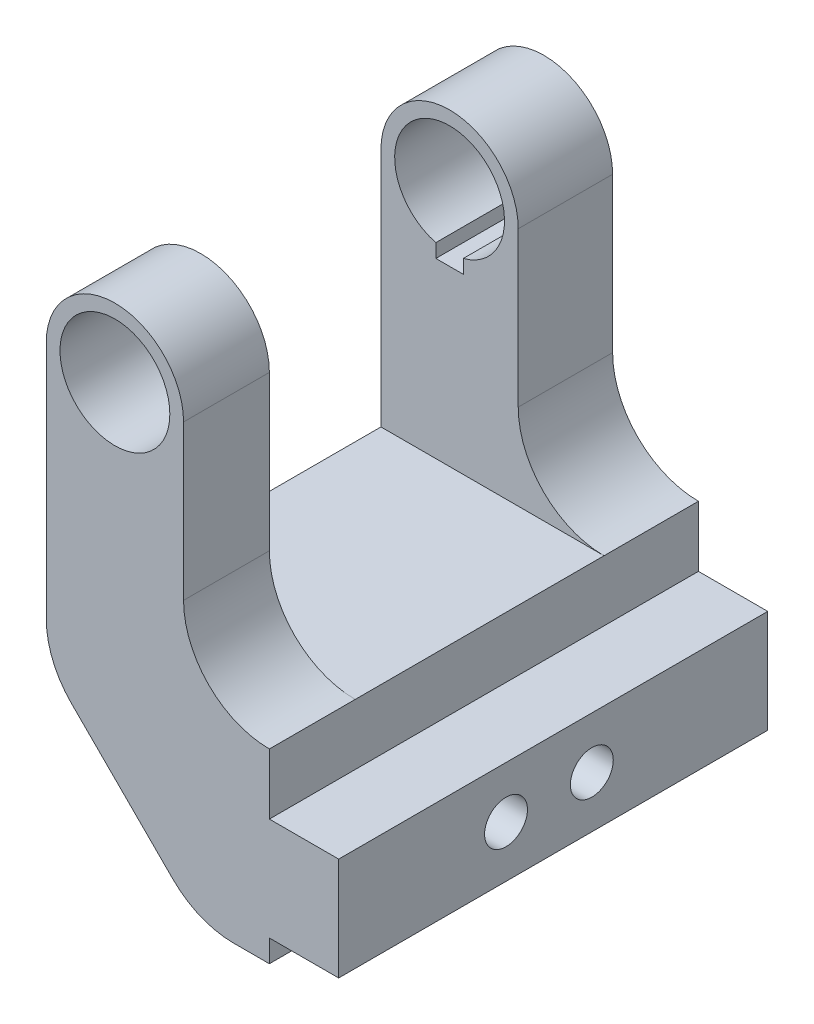
ISO-10303-21;
HEADER;
FILE_DESCRIPTION(('STEP AP214'),'2;1');
FILE_NAME('part.step','',(''),(''),'','','');
FILE_SCHEMA(('AUTOMOTIVE_DESIGN { 1 0 10303 214 1 1 1 1 }'));
ENDSEC;
DATA;
#1=APPLICATION_CONTEXT('core data for automotive mechanical design processes');
#2=APPLICATION_PROTOCOL_DEFINITION('international standard','automotive_design',2000,#1);
#3=PRODUCT_CONTEXT('',#1,'mechanical');
#4=PRODUCT('Part','Part','',(#3));
#5=PRODUCT_RELATED_PRODUCT_CATEGORY('part','',(#4));
#6=PRODUCT_DEFINITION_FORMATION('','',#4);
#7=PRODUCT_DEFINITION_CONTEXT('part definition',#1,'design');
#8=PRODUCT_DEFINITION('design','',#6,#7);
#9=PRODUCT_DEFINITION_SHAPE('','',#8);
#10=(LENGTH_UNIT() NAMED_UNIT(*) SI_UNIT(.MILLI.,.METRE.));
#11=(NAMED_UNIT(*) PLANE_ANGLE_UNIT() SI_UNIT($,.RADIAN.));
#12=(NAMED_UNIT(*) SI_UNIT($,.STERADIAN.) SOLID_ANGLE_UNIT());
#13=UNCERTAINTY_MEASURE_WITH_UNIT(LENGTH_MEASURE(1.E-05),#10,'distance_accuracy_value','');
#14=(GEOMETRIC_REPRESENTATION_CONTEXT(3) GLOBAL_UNCERTAINTY_ASSIGNED_CONTEXT((#13)) GLOBAL_UNIT_ASSIGNED_CONTEXT((#10,
#11,#12)) REPRESENTATION_CONTEXT('',''));
#15=CARTESIAN_POINT('',(0.,0.,0.));
#16=DIRECTION('',(0.,0.,1.));
#17=DIRECTION('',(1.,0.,0.));
#18=AXIS2_PLACEMENT_3D('',#15,#16,#17);
#19=CARTESIAN_POINT('',(-8.,0.,0.));
#20=DIRECTION('',(-1.,0.,0.));
#21=DIRECTION('',(0.,-1.,0.));
#22=AXIS2_PLACEMENT_3D('',#19,#20,#21);
#23=PLANE('',#22);
#24=DIRECTION('',(0.,-1.,0.));
#25=VECTOR('',#24,1.);
#26=CARTESIAN_POINT('',(-8.,0.,0.));
#27=LINE('',#26,#25);
#28=CARTESIAN_POINT('',(-8.,0.,0.));
#29=VERTEX_POINT('',#28);
#30=CARTESIAN_POINT('',(-8.,-27.857864376269,0.));
#31=VERTEX_POINT('',#30);
#32=EDGE_CURVE('E303',#29,#31,#27,.T.);
#33=ORIENTED_EDGE('',*,*,#32,.T.);
#34=DIRECTION('',(0.,0.,1.));
#35=VECTOR('',#34,1.);
#36=CARTESIAN_POINT('',(-8.,-27.857864376269,0.));
#37=LINE('',#36,#35);
#38=CARTESIAN_POINT('',(-8.00000000000066,-27.857864376269,11.));
#39=VERTEX_POINT('',#38);
#40=EDGE_CURVE('E420',#31,#39,#37,.T.);
#41=ORIENTED_EDGE('',*,*,#40,.T.);
#42=DIRECTION('',(0.,1.,0.));
#43=VECTOR('',#42,1.);
#44=CARTESIAN_POINT('',(-8.00000000000194,14.034109989606,11.));
#45=LINE('',#44,#43);
#46=CARTESIAN_POINT('',(-8.,0.,11.));
#47=VERTEX_POINT('',#46);
#48=EDGE_CURVE('E282',#39,#47,#45,.T.);
#49=ORIENTED_EDGE('',*,*,#48,.T.);
#50=DIRECTION('',(0.,0.,1.));
#51=VECTOR('',#50,1.);
#52=CARTESIAN_POINT('',(-8.,0.,0.));
#53=LINE('',#52,#51);
#54=EDGE_CURVE('E374',#29,#47,#53,.T.);
#55=ORIENTED_EDGE('',*,*,#54,.F.);
#56=EDGE_LOOP('',(#33,#41,#49,#55));
#57=FACE_BOUND('',#56,.T.);
#58=ADVANCED_FACE('F35',(#57),#23,.T.);
#59=CARTESIAN_POINT('',(0.,0.,0.));
#60=DIRECTION('',(0.,0.,1.));
#61=DIRECTION('',(1.,0.,0.));
#62=AXIS2_PLACEMENT_3D('',#59,#60,#61);
#63=CYLINDRICAL_SURFACE('',#62,8.);
#64=CARTESIAN_POINT('',(0.,0.,40.));
#65=DIRECTION('',(0.,0.,1.));
#66=DIRECTION('',(1.,0.,0.));
#67=AXIS2_PLACEMENT_3D('',#64,#65,#66);
#68=CIRCLE('',#67,8.);
#69=CARTESIAN_POINT('',(-8.00000000000151,0.,40.));
#70=VERTEX_POINT('',#69);
#71=CARTESIAN_POINT('',(8.,0.,40.));
#72=VERTEX_POINT('',#71);
#73=EDGE_CURVE('E297',#70,#72,#68,.F.);
#74=ORIENTED_EDGE('',*,*,#73,.F.);
#75=CARTESIAN_POINT('',(-8.,0.,50.));
#76=VERTEX_POINT('',#75);
#77=EDGE_CURVE('E329',#70,#76,#53,.T.);
#78=ORIENTED_EDGE('',*,*,#77,.T.);
#79=CARTESIAN_POINT('',(0.,0.,50.));
#80=DIRECTION('',(0.,0.,1.));
#81=DIRECTION('',(1.,0.,0.));
#82=AXIS2_PLACEMENT_3D('',#79,#80,#81);
#83=CIRCLE('',#82,8.);
#84=CARTESIAN_POINT('',(8.,0.,50.));
#85=VERTEX_POINT('',#84);
#86=EDGE_CURVE('E379',#85,#76,#83,.T.);
#87=ORIENTED_EDGE('',*,*,#86,.F.);
#88=DIRECTION('',(0.,0.,1.));
#89=VECTOR('',#88,1.);
#90=CARTESIAN_POINT('',(8.,0.,0.));
#91=LINE('',#90,#89);
#92=EDGE_CURVE('E357',#72,#85,#91,.T.);
#93=ORIENTED_EDGE('',*,*,#92,.F.);
#94=EDGE_LOOP('',(#74,#78,#87,#93));
#95=FACE_BOUND('',#94,.T.);
#96=ADVANCED_FACE('F471',(#95),#63,.T.);
#97=CARTESIAN_POINT('',(0.,0.,50.));
#98=DIRECTION('',(0.,0.,-1.));
#99=DIRECTION('',(-1.,0.,0.));
#100=AXIS2_PLACEMENT_3D('',#97,#98,#99);
#101=CYLINDRICAL_SURFACE('',#100,6.4);
#102=CARTESIAN_POINT('',(0.,0.,40.));
#103=DIRECTION('',(0.,0.,1.));
#104=DIRECTION('',(1.,0.,0.));
#105=AXIS2_PLACEMENT_3D('',#102,#103,#104);
#106=CIRCLE('',#105,6.4);
#107=CARTESIAN_POINT('',(6.4,0.,40.));
#108=VERTEX_POINT('',#107);
#109=EDGE_CURVE('E299',#108,#108,#106,.T.);
#110=ORIENTED_EDGE('',*,*,#109,.F.);
#111=EDGE_LOOP('',(#110));
#112=FACE_BOUND('',#111,.T.);
#113=CARTESIAN_POINT('',(0.,0.,50.));
#114=DIRECTION('',(0.,0.,1.));
#115=DIRECTION('',(1.,0.,0.));
#116=AXIS2_PLACEMENT_3D('',#113,#114,#115);
#117=CIRCLE('',#116,6.4);
#118=CARTESIAN_POINT('',(6.4,0.,50.));
#119=VERTEX_POINT('',#118);
#120=EDGE_CURVE('E382',#119,#119,#117,.T.);
#121=ORIENTED_EDGE('',*,*,#120,.T.);
#122=EDGE_LOOP('',(#121));
#123=FACE_BOUND('',#122,.T.);
#124=ADVANCED_FACE('F526',(#112,#123),#101,.F.);
#125=CARTESIAN_POINT('',(8.,0.,0.));
#126=DIRECTION('',(1.,0.,0.));
#127=DIRECTION('',(0.,1.,0.));
#128=AXIS2_PLACEMENT_3D('',#125,#126,#127);
#129=PLANE('',#128);
#130=DIRECTION('',(0.,1.,0.));
#131=VECTOR('',#130,1.);
#132=CARTESIAN_POINT('',(8.,0.,50.));
#133=LINE('',#132,#131);
#134=CARTESIAN_POINT('',(8.00000000000001,-18.,50.));
#135=VERTEX_POINT('',#134);
#136=EDGE_CURVE('E307',#135,#85,#133,.T.);
#137=ORIENTED_EDGE('',*,*,#136,.F.);
#138=DIRECTION('',(0.,0.,1.));
#139=VECTOR('',#138,1.);
#140=CARTESIAN_POINT('',(8.00000000000001,-18.,40.));
#141=LINE('',#140,#139);
#142=CARTESIAN_POINT('',(8.00000000000001,-18.,40.));
#143=VERTEX_POINT('',#142);
#144=EDGE_CURVE('E50',#135,#143,#141,.F.);
#145=ORIENTED_EDGE('',*,*,#144,.T.);
#146=DIRECTION('',(0.,-1.,0.));
#147=VECTOR('',#146,1.);
#148=CARTESIAN_POINT('',(8.,0.,40.));
#149=LINE('',#148,#147);
#150=EDGE_CURVE('E295',#72,#143,#149,.T.);
#151=ORIENTED_EDGE('',*,*,#150,.F.);
#152=ORIENTED_EDGE('',*,*,#92,.T.);
#153=EDGE_LOOP('',(#137,#145,#151,#152));
#154=FACE_BOUND('',#153,.T.);
#155=ADVANCED_FACE('F442',(#154),#129,.T.);
#156=CARTESIAN_POINT('',(0.,0.,11.));
#157=DIRECTION('',(0.,0.,-1.));
#158=DIRECTION('',(0.,1.,0.));
#159=AXIS2_PLACEMENT_3D('',#156,#157,#158);
#160=CIRCLE('',#159,8.);
#161=CARTESIAN_POINT('',(8.,0.,11.));
#162=VERTEX_POINT('',#161);
#163=EDGE_CURVE('E289',#162,#47,#160,.F.);
#164=ORIENTED_EDGE('',*,*,#163,.F.);
#165=CARTESIAN_POINT('',(8.,0.,0.));
#166=VERTEX_POINT('',#165);
#167=EDGE_CURVE('E353',#166,#162,#91,.T.);
#168=ORIENTED_EDGE('',*,*,#167,.F.);
#169=CARTESIAN_POINT('',(0.,0.,0.));
#170=DIRECTION('',(0.,0.,1.));
#171=DIRECTION('',(1.,0.,0.));
#172=AXIS2_PLACEMENT_3D('',#169,#170,#171);
#173=CIRCLE('',#172,8.);
#174=EDGE_CURVE('E356',#166,#29,#173,.T.);
#175=ORIENTED_EDGE('',*,*,#174,.T.);
#176=ORIENTED_EDGE('',*,*,#54,.T.);
#177=EDGE_LOOP('',(#164,#168,#175,#176));
#178=FACE_BOUND('',#177,.T.);
#179=ADVANCED_FACE('F519',(#178),#63,.T.);
#180=CARTESIAN_POINT('',(0.,0.,50.));
#181=DIRECTION('',(0.,0.,1.));
#182=DIRECTION('',(1.,0.,0.));
#183=AXIS2_PLACEMENT_3D('',#180,#181,#182);
#184=PLANE('',#183);
#185=ORIENTED_EDGE('',*,*,#120,.F.);
#186=EDGE_LOOP('',(#185));
#187=FACE_BOUND('',#186,.T.);
#188=DIRECTION('',(0.707106781186547,-0.707106781186547,0.));
#189=VECTOR('',#188,1.);
#190=CARTESIAN_POINT('',(-8.,-32.,50.));
#191=LINE('',#190,#189);
#192=CARTESIAN_POINT('',(-5.07106781186548,-34.9289321881345,50.));
#193=VERTEX_POINT('',#192);
#194=CARTESIAN_POINT('',(6.74873734152915,-46.7487373415292,50.));
#195=VERTEX_POINT('',#194);
#196=EDGE_CURVE('E332',#193,#195,#191,.T.);
#197=ORIENTED_EDGE('',*,*,#196,.T.);
#198=CARTESIAN_POINT('',(13.8198051533946,-39.6776695296637,50.));
#199=DIRECTION('',(0.,0.,1.));
#200=DIRECTION('',(1.,0.,0.));
#201=AXIS2_PLACEMENT_3D('',#198,#199,#200);
#202=CIRCLE('',#201,10.);
#203=CARTESIAN_POINT('',(13.8198051533946,-49.6776695296637,50.));
#204=VERTEX_POINT('',#203);
#205=EDGE_CURVE('E410',#195,#204,#202,.T.);
#206=ORIENTED_EDGE('',*,*,#205,.T.);
#207=DIRECTION('',(1.,0.,0.));
#208=VECTOR('',#207,1.);
#209=CARTESIAN_POINT('',(9.67766952966369,-49.6776695296637,50.));
#210=LINE('',#209,#208);
#211=CARTESIAN_POINT('',(18.,-49.6776695296637,50.));
#212=VERTEX_POINT('',#211);
#213=EDGE_CURVE('E335',#204,#212,#210,.T.);
#214=ORIENTED_EDGE('',*,*,#213,.T.);
#215=DIRECTION('',(0.,1.,0.));
#216=VECTOR('',#215,1.);
#217=CARTESIAN_POINT('',(18.,-49.6776695296637,50.));
#218=LINE('',#217,#216);
#219=CARTESIAN_POINT('',(18.,-47.076150071639,50.));
#220=VERTEX_POINT('',#219);
#221=EDGE_CURVE('E337',#212,#220,#218,.T.);
#222=ORIENTED_EDGE('',*,*,#221,.T.);
#223=DIRECTION('',(1.,0.,0.));
#224=VECTOR('',#223,1.);
#225=CARTESIAN_POINT('',(18.,-47.076150071639,50.));
#226=LINE('',#225,#224);
#227=CARTESIAN_POINT('',(26.076150071639,-47.076150071639,50.));
#228=VERTEX_POINT('',#227);
#229=EDGE_CURVE('E340',#220,#228,#226,.T.);
#230=ORIENTED_EDGE('',*,*,#229,.T.);
#231=DIRECTION('',(0.,1.,0.));
#232=VECTOR('',#231,1.);
#233=CARTESIAN_POINT('',(26.076150071639,-47.076150071639,50.));
#234=LINE('',#233,#232);
#235=CARTESIAN_POINT('',(26.076150071639,-35.076150071639,50.));
#236=VERTEX_POINT('',#235);
#237=EDGE_CURVE('E343',#228,#236,#234,.T.);
#238=ORIENTED_EDGE('',*,*,#237,.T.);
#239=DIRECTION('',(-1.,0.,0.));
#240=VECTOR('',#239,1.);
#241=CARTESIAN_POINT('',(18.,-35.076150071639,50.));
#242=LINE('',#241,#240);
#243=CARTESIAN_POINT('',(18.,-35.076150071639,50.));
#244=VERTEX_POINT('',#243);
#245=EDGE_CURVE('E346',#236,#244,#242,.T.);
#246=ORIENTED_EDGE('',*,*,#245,.T.);
#247=DIRECTION('',(0.,1.,0.));
#248=VECTOR('',#247,1.);
#249=CARTESIAN_POINT('',(18.,-28.,50.));
#250=LINE('',#249,#248);
#251=CARTESIAN_POINT('',(18.,-28.,50.));
#252=VERTEX_POINT('',#251);
#253=EDGE_CURVE('E349',#244,#252,#250,.T.);
#254=ORIENTED_EDGE('',*,*,#253,.T.);
#255=CARTESIAN_POINT('',(18.,-18.,50.));
#256=DIRECTION('',(0.,0.,1.));
#257=DIRECTION('',(1.,0.,0.));
#258=AXIS2_PLACEMENT_3D('',#255,#256,#257);
#259=CIRCLE('',#258,10.);
#260=EDGE_CURVE('E43',#252,#135,#259,.F.);
#261=ORIENTED_EDGE('',*,*,#260,.T.);
#262=ORIENTED_EDGE('',*,*,#136,.T.);
#263=ORIENTED_EDGE('',*,*,#86,.T.);
#264=DIRECTION('',(0.,-1.,0.));
#265=VECTOR('',#264,1.);
#266=CARTESIAN_POINT('',(-8.,0.,50.));
#267=LINE('',#266,#265);
#268=CARTESIAN_POINT('',(-8.,-27.857864376269,50.));
#269=VERTEX_POINT('',#268);
#270=EDGE_CURVE('E302',#76,#269,#267,.T.);
#271=ORIENTED_EDGE('',*,*,#270,.T.);
#272=CARTESIAN_POINT('',(2.,-27.857864376269,50.));
#273=DIRECTION('',(0.,0.,1.));
#274=DIRECTION('',(1.,0.,0.));
#275=AXIS2_PLACEMENT_3D('',#272,#273,#274);
#276=CIRCLE('',#275,10.);
#277=EDGE_CURVE('E408',#269,#193,#276,.T.);
#278=ORIENTED_EDGE('',*,*,#277,.T.);
#279=EDGE_LOOP('',(#197,#206,#214,#222,#230,#238,#246,#254,#261,#262,#263,#271,#278));
#280=FACE_BOUND('',#279,.T.);
#281=ADVANCED_FACE('F436',(#187,#280),#184,.T.);
#282=CARTESIAN_POINT('',(0.,0.,0.));
#283=DIRECTION('',(0.,0.,1.));
#284=DIRECTION('',(1.,0.,0.));
#285=AXIS2_PLACEMENT_3D('',#282,#283,#284);
#286=PLANE('',#285);
#287=DIRECTION('',(-1.,0.,0.));
#288=VECTOR('',#287,1.);
#289=CARTESIAN_POINT('',(1.6,-7.79677335393187,0.));
#290=LINE('',#289,#288);
#291=CARTESIAN_POINT('',(1.6,-7.79677335393187,0.));
#292=VERTEX_POINT('',#291);
#293=CARTESIAN_POINT('',(-1.6,-7.79677335393187,0.));
#294=VERTEX_POINT('',#293);
#295=EDGE_CURVE('E229',#292,#294,#290,.T.);
#296=ORIENTED_EDGE('',*,*,#295,.F.);
#297=DIRECTION('',(0.,-1.,0.));
#298=VECTOR('',#297,1.);
#299=CARTESIAN_POINT('',(1.6,-6.19677335393187,0.));
#300=LINE('',#299,#298);
#301=CARTESIAN_POINT('',(1.6,-6.19677335393187,0.));
#302=VERTEX_POINT('',#301);
#303=EDGE_CURVE('E226',#302,#292,#300,.T.);
#304=ORIENTED_EDGE('',*,*,#303,.F.);
#305=CARTESIAN_POINT('',(0.,0.,0.));
#306=DIRECTION('',(0.,0.,1.));
#307=DIRECTION('',(1.,0.,0.));
#308=AXIS2_PLACEMENT_3D('',#305,#306,#307);
#309=CIRCLE('',#308,6.4);
#310=CARTESIAN_POINT('',(-1.6,-6.19677335393187,0.));
#311=VERTEX_POINT('',#310);
#312=EDGE_CURVE('E241',#302,#311,#309,.T.);
#313=ORIENTED_EDGE('',*,*,#312,.T.);
#314=DIRECTION('',(0.,1.,0.));
#315=VECTOR('',#314,1.);
#316=CARTESIAN_POINT('',(-1.6,-7.79677335393187,0.));
#317=LINE('',#316,#315);
#318=EDGE_CURVE('E219',#294,#311,#317,.T.);
#319=ORIENTED_EDGE('',*,*,#318,.F.);
#320=EDGE_LOOP('',(#296,#304,#313,#319));
#321=FACE_BOUND('',#320,.T.);
#322=DIRECTION('',(1.,0.,0.));
#323=VECTOR('',#322,1.);
#324=CARTESIAN_POINT('',(9.67766952966369,-49.6776695296637,0.));
#325=LINE('',#324,#323);
#326=CARTESIAN_POINT('',(13.8198051533946,-49.6776695296637,0.));
#327=VERTEX_POINT('',#326);
#328=CARTESIAN_POINT('',(18.,-49.6776695296637,0.));
#329=VERTEX_POINT('',#328);
#330=EDGE_CURVE('E310',#327,#329,#325,.T.);
#331=ORIENTED_EDGE('',*,*,#330,.F.);
#332=CARTESIAN_POINT('',(13.8198051533946,-39.6776695296637,0.));
#333=DIRECTION('',(0.,0.,1.));
#334=DIRECTION('',(1.,0.,0.));
#335=AXIS2_PLACEMENT_3D('',#332,#333,#334);
#336=CIRCLE('',#335,10.);
#337=CARTESIAN_POINT('',(6.74873734152915,-46.7487373415292,0.));
#338=VERTEX_POINT('',#337);
#339=EDGE_CURVE('E416',#327,#338,#336,.F.);
#340=ORIENTED_EDGE('',*,*,#339,.T.);
#341=DIRECTION('',(0.707106781186547,-0.707106781186547,0.));
#342=VECTOR('',#341,1.);
#343=CARTESIAN_POINT('',(-8.,-32.,0.));
#344=LINE('',#343,#342);
#345=CARTESIAN_POINT('',(-5.07106781186548,-34.9289321881345,0.));
#346=VERTEX_POINT('',#345);
#347=EDGE_CURVE('E306',#346,#338,#344,.T.);
#348=ORIENTED_EDGE('',*,*,#347,.F.);
#349=CARTESIAN_POINT('',(2.,-27.857864376269,0.));
#350=DIRECTION('',(0.,0.,1.));
#351=DIRECTION('',(1.,0.,0.));
#352=AXIS2_PLACEMENT_3D('',#349,#350,#351);
#353=CIRCLE('',#352,10.);
#354=EDGE_CURVE('E414',#346,#31,#353,.F.);
#355=ORIENTED_EDGE('',*,*,#354,.T.);
#356=ORIENTED_EDGE('',*,*,#32,.F.);
#357=ORIENTED_EDGE('',*,*,#174,.F.);
#358=DIRECTION('',(0.,1.,0.));
#359=VECTOR('',#358,1.);
#360=CARTESIAN_POINT('',(8.,0.,0.));
#361=LINE('',#360,#359);
#362=CARTESIAN_POINT('',(8.00000000000001,-18.,0.));
#363=VERTEX_POINT('',#362);
#364=EDGE_CURVE('E327',#363,#166,#361,.T.);
#365=ORIENTED_EDGE('',*,*,#364,.F.);
#366=CARTESIAN_POINT('',(18.,-18.,0.));
#367=DIRECTION('',(0.,0.,1.));
#368=DIRECTION('',(1.,0.,0.));
#369=AXIS2_PLACEMENT_3D('',#366,#367,#368);
#370=CIRCLE('',#369,10.);
#371=CARTESIAN_POINT('',(18.,-28.,0.));
#372=VERTEX_POINT('',#371);
#373=EDGE_CURVE('E434',#363,#372,#370,.T.);
#374=ORIENTED_EDGE('',*,*,#373,.T.);
#375=DIRECTION('',(0.,1.,0.));
#376=VECTOR('',#375,1.);
#377=CARTESIAN_POINT('',(18.,-28.,0.));
#378=LINE('',#377,#376);
#379=CARTESIAN_POINT('',(18.,-35.076150071639,0.));
#380=VERTEX_POINT('',#379);
#381=EDGE_CURVE('E324',#380,#372,#378,.T.);
#382=ORIENTED_EDGE('',*,*,#381,.F.);
#383=DIRECTION('',(-1.,0.,0.));
#384=VECTOR('',#383,1.);
#385=CARTESIAN_POINT('',(18.,-35.076150071639,0.));
#386=LINE('',#385,#384);
#387=CARTESIAN_POINT('',(26.076150071639,-35.076150071639,0.));
#388=VERTEX_POINT('',#387);
#389=EDGE_CURVE('E321',#388,#380,#386,.T.);
#390=ORIENTED_EDGE('',*,*,#389,.F.);
#391=DIRECTION('',(0.,1.,0.));
#392=VECTOR('',#391,1.);
#393=CARTESIAN_POINT('',(26.076150071639,-47.076150071639,0.));
#394=LINE('',#393,#392);
#395=CARTESIAN_POINT('',(26.076150071639,-47.076150071639,0.));
#396=VERTEX_POINT('',#395);
#397=EDGE_CURVE('E318',#396,#388,#394,.T.);
#398=ORIENTED_EDGE('',*,*,#397,.F.);
#399=DIRECTION('',(1.,0.,0.));
#400=VECTOR('',#399,1.);
#401=CARTESIAN_POINT('',(18.,-47.076150071639,0.));
#402=LINE('',#401,#400);
#403=CARTESIAN_POINT('',(18.,-47.076150071639,0.));
#404=VERTEX_POINT('',#403);
#405=EDGE_CURVE('E315',#404,#396,#402,.T.);
#406=ORIENTED_EDGE('',*,*,#405,.F.);
#407=DIRECTION('',(0.,1.,0.));
#408=VECTOR('',#407,1.);
#409=CARTESIAN_POINT('',(18.,-49.6776695296637,0.));
#410=LINE('',#409,#408);
#411=EDGE_CURVE('E312',#329,#404,#410,.T.);
#412=ORIENTED_EDGE('',*,*,#411,.F.);
#413=EDGE_LOOP('',(#331,#340,#348,#355,#356,#357,#365,#374,#382,#390,#398,#406,#412));
#414=FACE_BOUND('',#413,.T.);
#415=ADVANCED_FACE('F238',(#321,#414),#286,.F.);
#416=DIRECTION('',(0.,0.,-1.));
#417=VECTOR('',#416,1.);
#418=CARTESIAN_POINT('',(1.6,-6.19677335393187,20.));
#419=LINE('',#418,#417);
#420=CARTESIAN_POINT('',(1.6,-6.19677335393187,11.));
#421=VERTEX_POINT('',#420);
#422=EDGE_CURVE('E247',#421,#302,#419,.T.);
#423=ORIENTED_EDGE('',*,*,#422,.F.);
#424=CARTESIAN_POINT('',(0.,0.,11.));
#425=DIRECTION('',(0.,0.,-1.));
#426=DIRECTION('',(0.,1.,0.));
#427=AXIS2_PLACEMENT_3D('',#424,#425,#426);
#428=CIRCLE('',#427,6.4);
#429=CARTESIAN_POINT('',(-1.6,-6.19677335393187,11.));
#430=VERTEX_POINT('',#429);
#431=EDGE_CURVE('E292',#430,#421,#428,.T.);
#432=ORIENTED_EDGE('',*,*,#431,.F.);
#433=DIRECTION('',(0.,0.,-1.));
#434=VECTOR('',#433,1.);
#435=CARTESIAN_POINT('',(-1.6,-6.19677335393187,20.));
#436=LINE('',#435,#434);
#437=EDGE_CURVE('E225',#430,#311,#436,.T.);
#438=ORIENTED_EDGE('',*,*,#437,.T.);
#439=ORIENTED_EDGE('',*,*,#312,.F.);
#440=EDGE_LOOP('',(#423,#432,#438,#439));
#441=FACE_BOUND('',#440,.T.);
#442=ADVANCED_FACE('F558',(#441),#101,.F.);
#443=DIRECTION('',(0.,1.,0.));
#444=VECTOR('',#443,1.);
#445=CARTESIAN_POINT('',(8.,0.,11.));
#446=LINE('',#445,#444);
#447=CARTESIAN_POINT('',(8.00000000000001,-18.,11.));
#448=VERTEX_POINT('',#447);
#449=EDGE_CURVE('E286',#448,#162,#446,.T.);
#450=ORIENTED_EDGE('',*,*,#449,.F.);
#451=DIRECTION('',(0.,0.,1.));
#452=VECTOR('',#451,1.);
#453=CARTESIAN_POINT('',(8.00000000000001,-18.,0.));
#454=LINE('',#453,#452);
#455=EDGE_CURVE('E429',#448,#363,#454,.F.);
#456=ORIENTED_EDGE('',*,*,#455,.T.);
#457=ORIENTED_EDGE('',*,*,#364,.T.);
#458=ORIENTED_EDGE('',*,*,#167,.T.);
#459=EDGE_LOOP('',(#450,#456,#457,#458));
#460=FACE_BOUND('',#459,.T.);
#461=ADVANCED_FACE('F516',(#460),#129,.T.);
#462=CARTESIAN_POINT('',(8.00000000000001,-28.,0.));
#463=DIRECTION('',(0.,1.,0.));
#464=DIRECTION('',(0.,0.,1.));
#465=AXIS2_PLACEMENT_3D('',#462,#463,#464);
#466=PLANE('',#465);
#467=DIRECTION('',(1.,0.,0.));
#468=VECTOR('',#467,1.);
#469=CARTESIAN_POINT('',(-8.00000000000066,-28.0000000000005,11.));
#470=LINE('',#469,#468);
#471=CARTESIAN_POINT('',(-7.99898982220037,-28.0000000000005,11.));
#472=VERTEX_POINT('',#471);
#473=CARTESIAN_POINT('',(18.,-28.,11.));
#474=VERTEX_POINT('',#473);
#475=EDGE_CURVE('E284',#472,#474,#470,.T.);
#476=ORIENTED_EDGE('',*,*,#475,.F.);
#477=DIRECTION('',(0.,0.,1.));
#478=VECTOR('',#477,1.);
#479=CARTESIAN_POINT('',(-7.99898982220037,-28.0000000000005,11.));
#480=LINE('',#479,#478);
#481=CARTESIAN_POINT('',(-7.99898982220037,-28.0000000000005,40.));
#482=VERTEX_POINT('',#481);
#483=EDGE_CURVE('E425',#472,#482,#480,.T.);
#484=ORIENTED_EDGE('',*,*,#483,.T.);
#485=DIRECTION('',(1.,0.,0.));
#486=VECTOR('',#485,1.);
#487=CARTESIAN_POINT('',(-8.00000000000066,-28.0000000000005,40.));
#488=LINE('',#487,#486);
#489=CARTESIAN_POINT('',(18.,-28.,40.));
#490=VERTEX_POINT('',#489);
#491=EDGE_CURVE('E58',#482,#490,#488,.T.);
#492=ORIENTED_EDGE('',*,*,#491,.T.);
#493=DIRECTION('',(0.,0.,1.));
#494=VECTOR('',#493,1.);
#495=CARTESIAN_POINT('',(18.,-28.,0.));
#496=LINE('',#495,#494);
#497=EDGE_CURVE('E361',#474,#490,#496,.T.);
#498=ORIENTED_EDGE('',*,*,#497,.F.);
#499=EDGE_LOOP('',(#476,#484,#492,#498));
#500=FACE_BOUND('',#499,.T.);
#501=ADVANCED_FACE('F454',(#500),#466,.T.);
#502=CARTESIAN_POINT('',(18.,-28.,0.));
#503=DIRECTION('',(1.,0.,0.));
#504=DIRECTION('',(0.,1.,0.));
#505=AXIS2_PLACEMENT_3D('',#502,#503,#504);
#506=PLANE('',#505);
#507=ORIENTED_EDGE('',*,*,#253,.F.);
#508=DIRECTION('',(0.,0.,1.));
#509=VECTOR('',#508,1.);
#510=CARTESIAN_POINT('',(18.,-35.076150071639,0.));
#511=LINE('',#510,#509);
#512=EDGE_CURVE('E363',#380,#244,#511,.T.);
#513=ORIENTED_EDGE('',*,*,#512,.F.);
#514=ORIENTED_EDGE('',*,*,#381,.T.);
#515=EDGE_CURVE('E358',#372,#474,#496,.T.);
#516=ORIENTED_EDGE('',*,*,#515,.T.);
#517=ORIENTED_EDGE('',*,*,#497,.T.);
#518=EDGE_CURVE('E362',#490,#252,#496,.T.);
#519=ORIENTED_EDGE('',*,*,#518,.T.);
#520=EDGE_LOOP('',(#507,#513,#514,#516,#517,#519));
#521=FACE_BOUND('',#520,.T.);
#522=ADVANCED_FACE('F451',(#521),#506,.T.);
#523=CARTESIAN_POINT('',(18.,-35.076150071639,0.));
#524=DIRECTION('',(0.,1.,0.));
#525=DIRECTION('',(0.,0.,1.));
#526=AXIS2_PLACEMENT_3D('',#523,#524,#525);
#527=PLANE('',#526);
#528=ORIENTED_EDGE('',*,*,#245,.F.);
#529=DIRECTION('',(0.,0.,1.));
#530=VECTOR('',#529,1.);
#531=CARTESIAN_POINT('',(26.076150071639,-35.076150071639,0.));
#532=LINE('',#531,#530);
#533=EDGE_CURVE('E365',#388,#236,#532,.T.);
#534=ORIENTED_EDGE('',*,*,#533,.F.);
#535=ORIENTED_EDGE('',*,*,#389,.T.);
#536=ORIENTED_EDGE('',*,*,#512,.T.);
#537=EDGE_LOOP('',(#528,#534,#535,#536));
#538=FACE_BOUND('',#537,.T.);
#539=ADVANCED_FACE('F503',(#538),#527,.T.);
#540=CARTESIAN_POINT('',(26.076150071639,-47.076150071639,0.));
#541=DIRECTION('',(1.,0.,0.));
#542=DIRECTION('',(0.,1.,0.));
#543=AXIS2_PLACEMENT_3D('',#540,#541,#542);
#544=PLANE('',#543);
#545=CARTESIAN_POINT('',(26.076150071639,-41.076150071639,20.5));
#546=DIRECTION('',(1.,0.,0.));
#547=DIRECTION('',(0.,1.,0.));
#548=AXIS2_PLACEMENT_3D('',#545,#546,#547);
#549=CIRCLE('',#548,2.5);
#550=CARTESIAN_POINT('',(26.076150071639,-38.576150071639,20.5));
#551=VERTEX_POINT('',#550);
#552=EDGE_CURVE('E279',#551,#551,#549,.T.);
#553=ORIENTED_EDGE('',*,*,#552,.F.);
#554=EDGE_LOOP('',(#553));
#555=FACE_BOUND('',#554,.T.);
#556=CARTESIAN_POINT('',(26.076150071639,-41.076150071639,30.5));
#557=DIRECTION('',(1.,0.,0.));
#558=DIRECTION('',(0.,1.,0.));
#559=AXIS2_PLACEMENT_3D('',#556,#557,#558);
#560=CIRCLE('',#559,2.5);
#561=CARTESIAN_POINT('',(26.076150071639,-38.576150071639,30.5));
#562=VERTEX_POINT('',#561);
#563=EDGE_CURVE('E276',#562,#562,#560,.T.);
#564=ORIENTED_EDGE('',*,*,#563,.F.);
#565=EDGE_LOOP('',(#564));
#566=FACE_BOUND('',#565,.T.);
#567=ORIENTED_EDGE('',*,*,#237,.F.);
#568=DIRECTION('',(0.,0.,1.));
#569=VECTOR('',#568,1.);
#570=CARTESIAN_POINT('',(26.076150071639,-47.076150071639,0.));
#571=LINE('',#570,#569);
#572=EDGE_CURVE('E367',#396,#228,#571,.T.);
#573=ORIENTED_EDGE('',*,*,#572,.F.);
#574=ORIENTED_EDGE('',*,*,#397,.T.);
#575=ORIENTED_EDGE('',*,*,#533,.T.);
#576=EDGE_LOOP('',(#567,#573,#574,#575));
#577=FACE_BOUND('',#576,.T.);
#578=ADVANCED_FACE('F499',(#555,#566,#577),#544,.T.);
#579=CARTESIAN_POINT('',(18.,-47.076150071639,0.));
#580=DIRECTION('',(0.,-1.,0.));
#581=DIRECTION('',(0.,0.,-1.));
#582=AXIS2_PLACEMENT_3D('',#579,#580,#581);
#583=PLANE('',#582);
#584=ORIENTED_EDGE('',*,*,#229,.F.);
#585=DIRECTION('',(0.,0.,1.));
#586=VECTOR('',#585,1.);
#587=CARTESIAN_POINT('',(18.,-47.076150071639,0.));
#588=LINE('',#587,#586);
#589=EDGE_CURVE('E369',#404,#220,#588,.T.);
#590=ORIENTED_EDGE('',*,*,#589,.F.);
#591=ORIENTED_EDGE('',*,*,#405,.T.);
#592=ORIENTED_EDGE('',*,*,#572,.T.);
#593=EDGE_LOOP('',(#584,#590,#591,#592));
#594=FACE_BOUND('',#593,.T.);
#595=ADVANCED_FACE('F495',(#594),#583,.T.);
#596=CARTESIAN_POINT('',(18.,-49.6776695296637,0.));
#597=DIRECTION('',(1.,0.,0.));
#598=DIRECTION('',(0.,0.,-1.));
#599=AXIS2_PLACEMENT_3D('',#596,#597,#598);
#600=PLANE('',#599);
#601=ORIENTED_EDGE('',*,*,#221,.F.);
#602=DIRECTION('',(0.,0.,1.));
#603=VECTOR('',#602,1.);
#604=CARTESIAN_POINT('',(18.,-49.6776695296637,0.));
#605=LINE('',#604,#603);
#606=EDGE_CURVE('E371',#329,#212,#605,.T.);
#607=ORIENTED_EDGE('',*,*,#606,.F.);
#608=ORIENTED_EDGE('',*,*,#411,.T.);
#609=ORIENTED_EDGE('',*,*,#589,.T.);
#610=EDGE_LOOP('',(#601,#607,#608,#609));
#611=FACE_BOUND('',#610,.T.);
#612=ADVANCED_FACE('F491',(#611),#600,.T.);
#613=CARTESIAN_POINT('',(9.67766952966369,-49.6776695296637,0.));
#614=DIRECTION('',(0.,-1.,0.));
#615=DIRECTION('',(0.,0.,-1.));
#616=AXIS2_PLACEMENT_3D('',#613,#614,#615);
#617=PLANE('',#616);
#618=ORIENTED_EDGE('',*,*,#213,.F.);
#619=DIRECTION('',(0.,0.,1.));
#620=VECTOR('',#619,1.);
#621=CARTESIAN_POINT('',(13.8198051533946,-49.6776695296637,0.));
#622=LINE('',#621,#620);
#623=EDGE_CURVE('E412',#204,#327,#622,.F.);
#624=ORIENTED_EDGE('',*,*,#623,.T.);
#625=ORIENTED_EDGE('',*,*,#330,.T.);
#626=ORIENTED_EDGE('',*,*,#606,.T.);
#627=EDGE_LOOP('',(#618,#624,#625,#626));
#628=FACE_BOUND('',#627,.T.);
#629=ADVANCED_FACE('F487',(#628),#617,.T.);
#630=CARTESIAN_POINT('',(-8.,-32.,0.));
#631=DIRECTION('',(-0.707106781186547,-0.707106781186547,0.));
#632=DIRECTION('',(0.707106781186548,-0.707106781186548,0.));
#633=AXIS2_PLACEMENT_3D('',#630,#631,#632);
#634=PLANE('',#633);
#635=CARTESIAN_POINT('',(1.07615007163897,-41.076150071639,20.5));
#636=DIRECTION('',(-0.707106781186547,-0.707106781186547,0.));
#637=DIRECTION('',(0.707106781186548,-0.707106781186548,0.));
#638=AXIS2_PLACEMENT_3D('',#635,#636,#637);
#639=ELLIPSE('',#638,7.07106781186548,5.);
#640=CARTESIAN_POINT('',(-3.92384992836102,-36.076150071639,20.5));
#641=VERTEX_POINT('',#640);
#642=CARTESIAN_POINT('',(6.07615007163898,-46.076150071639,20.5));
#643=VERTEX_POINT('',#642);
#644=EDGE_CURVE('E395',#641,#643,#639,.T.);
#645=ORIENTED_EDGE('',*,*,#644,.F.);
#646=DIRECTION('',(0.,0.,1.));
#647=VECTOR('',#646,1.);
#648=CARTESIAN_POINT('',(-3.92384992836102,-36.076150071639,20.5));
#649=LINE('',#648,#647);
#650=CARTESIAN_POINT('',(-3.92384992836102,-36.076150071639,30.5));
#651=VERTEX_POINT('',#650);
#652=EDGE_CURVE('E250',#641,#651,#649,.T.);
#653=ORIENTED_EDGE('',*,*,#652,.T.);
#654=CARTESIAN_POINT('',(1.07615007163897,-41.076150071639,30.5));
#655=DIRECTION('',(-0.707106781186547,-0.707106781186547,0.));
#656=DIRECTION('',(0.707106781186548,-0.707106781186548,0.));
#657=AXIS2_PLACEMENT_3D('',#654,#655,#656);
#658=ELLIPSE('',#657,7.07106781186549,5.00000000000001);
#659=CARTESIAN_POINT('',(6.07615007163899,-46.076150071639,30.5));
#660=VERTEX_POINT('',#659);
#661=EDGE_CURVE('E388',#660,#651,#658,.T.);
#662=ORIENTED_EDGE('',*,*,#661,.F.);
#663=DIRECTION('',(0.,0.,1.));
#664=VECTOR('',#663,1.);
#665=CARTESIAN_POINT('',(6.07615007163898,-46.076150071639,0.));
#666=LINE('',#665,#664);
#667=EDGE_CURVE('E393',#643,#660,#666,.T.);
#668=ORIENTED_EDGE('',*,*,#667,.F.);
#669=EDGE_LOOP('',(#645,#653,#662,#668));
#670=FACE_BOUND('',#669,.T.);
#671=ORIENTED_EDGE('',*,*,#347,.T.);
#672=DIRECTION('',(0.,0.,1.));
#673=VECTOR('',#672,1.);
#674=CARTESIAN_POINT('',(6.74873734152916,-46.7487373415292,0.));
#675=LINE('',#674,#673);
#676=EDGE_CURVE('E405',#338,#195,#675,.T.);
#677=ORIENTED_EDGE('',*,*,#676,.T.);
#678=ORIENTED_EDGE('',*,*,#196,.F.);
#679=DIRECTION('',(0.,0.,1.));
#680=VECTOR('',#679,1.);
#681=CARTESIAN_POINT('',(-5.07106781186548,-34.9289321881345,0.));
#682=LINE('',#681,#680);
#683=EDGE_CURVE('E403',#193,#346,#682,.F.);
#684=ORIENTED_EDGE('',*,*,#683,.T.);
#685=EDGE_LOOP('',(#671,#677,#678,#684));
#686=FACE_BOUND('',#685,.T.);
#687=ADVANCED_FACE('F476',(#670,#686),#634,.T.);
#688=DIRECTION('',(0.,1.,0.));
#689=VECTOR('',#688,1.);
#690=CARTESIAN_POINT('',(-8.,0.,40.));
#691=LINE('',#690,#689);
#692=CARTESIAN_POINT('',(-8.,-27.857864376269,40.));
#693=VERTEX_POINT('',#692);
#694=EDGE_CURVE('E385',#693,#70,#691,.T.);
#695=ORIENTED_EDGE('',*,*,#694,.F.);
#696=DIRECTION('',(0.,0.,1.));
#697=VECTOR('',#696,1.);
#698=CARTESIAN_POINT('',(-8.,-27.857864376269,0.));
#699=LINE('',#698,#697);
#700=EDGE_CURVE('E418',#693,#269,#699,.T.);
#701=ORIENTED_EDGE('',*,*,#700,.T.);
#702=ORIENTED_EDGE('',*,*,#270,.F.);
#703=ORIENTED_EDGE('',*,*,#77,.F.);
#704=EDGE_LOOP('',(#695,#701,#702,#703));
#705=FACE_BOUND('',#704,.T.);
#706=ADVANCED_FACE('F468',(#705),#23,.T.);
#707=CARTESIAN_POINT('',(-8.00000000000066,-28.0000000000005,40.));
#708=DIRECTION('',(0.,0.,1.));
#709=DIRECTION('',(1.,0.,0.));
#710=AXIS2_PLACEMENT_3D('',#707,#708,#709);
#711=PLANE('',#710);
#712=ORIENTED_EDGE('',*,*,#109,.T.);
#713=EDGE_LOOP('',(#712));
#714=FACE_BOUND('',#713,.T.);
#715=ORIENTED_EDGE('',*,*,#491,.F.);
#716=CARTESIAN_POINT('',(2.,-27.857864376269,40.));
#717=DIRECTION('',(0.,0.,1.));
#718=DIRECTION('',(1.,0.,0.));
#719=AXIS2_PLACEMENT_3D('',#716,#717,#718);
#720=CIRCLE('',#719,10.);
#721=EDGE_CURVE('E427',#482,#693,#720,.F.);
#722=ORIENTED_EDGE('',*,*,#721,.T.);
#723=ORIENTED_EDGE('',*,*,#694,.T.);
#724=ORIENTED_EDGE('',*,*,#73,.T.);
#725=ORIENTED_EDGE('',*,*,#150,.T.);
#726=CARTESIAN_POINT('',(18.,-18.,40.));
#727=DIRECTION('',(0.,0.,1.));
#728=DIRECTION('',(1.,0.,0.));
#729=AXIS2_PLACEMENT_3D('',#726,#727,#728);
#730=CIRCLE('',#729,10.);
#731=EDGE_CURVE('E11',#143,#490,#730,.T.);
#732=ORIENTED_EDGE('',*,*,#731,.T.);
#733=EDGE_LOOP('',(#715,#722,#723,#724,#725,#732));
#734=FACE_BOUND('',#733,.T.);
#735=ADVANCED_FACE('F448',(#714,#734),#711,.F.);
#736=CARTESIAN_POINT('',(-8.00000000000194,14.034109989606,11.));
#737=DIRECTION('',(0.,0.,-1.));
#738=DIRECTION('',(0.,1.,0.));
#739=AXIS2_PLACEMENT_3D('',#736,#737,#738);
#740=PLANE('',#739);
#741=ORIENTED_EDGE('',*,*,#431,.T.);
#742=DIRECTION('',(0.,-1.,0.));
#743=VECTOR('',#742,1.);
#744=CARTESIAN_POINT('',(1.6,14.034109989606,11.));
#745=LINE('',#744,#743);
#746=CARTESIAN_POINT('',(1.6,-7.79677335393187,11.));
#747=VERTEX_POINT('',#746);
#748=EDGE_CURVE('E400',#421,#747,#745,.T.);
#749=ORIENTED_EDGE('',*,*,#748,.T.);
#750=DIRECTION('',(-1.,0.,0.));
#751=VECTOR('',#750,1.);
#752=CARTESIAN_POINT('',(-8.00000000000194,-7.79677335393187,11.));
#753=LINE('',#752,#751);
#754=CARTESIAN_POINT('',(-1.6,-7.79677335393187,11.));
#755=VERTEX_POINT('',#754);
#756=EDGE_CURVE('E398',#747,#755,#753,.T.);
#757=ORIENTED_EDGE('',*,*,#756,.T.);
#758=DIRECTION('',(0.,1.,0.));
#759=VECTOR('',#758,1.);
#760=CARTESIAN_POINT('',(-1.6,14.034109989606,11.));
#761=LINE('',#760,#759);
#762=EDGE_CURVE('E222',#755,#430,#761,.T.);
#763=ORIENTED_EDGE('',*,*,#762,.T.);
#764=EDGE_LOOP('',(#741,#749,#757,#763));
#765=FACE_BOUND('',#764,.T.);
#766=ORIENTED_EDGE('',*,*,#48,.F.);
#767=CARTESIAN_POINT('',(2.,-27.857864376269,11.));
#768=DIRECTION('',(0.,0.,-1.));
#769=DIRECTION('',(0.,1.,0.));
#770=AXIS2_PLACEMENT_3D('',#767,#768,#769);
#771=CIRCLE('',#770,10.);
#772=EDGE_CURVE('E423',#39,#472,#771,.F.);
#773=ORIENTED_EDGE('',*,*,#772,.T.);
#774=ORIENTED_EDGE('',*,*,#475,.T.);
#775=CARTESIAN_POINT('',(18.,-18.,11.));
#776=DIRECTION('',(0.,0.,-1.));
#777=DIRECTION('',(0.,1.,0.));
#778=AXIS2_PLACEMENT_3D('',#775,#776,#777);
#779=CIRCLE('',#778,10.);
#780=EDGE_CURVE('E432',#474,#448,#779,.T.);
#781=ORIENTED_EDGE('',*,*,#780,.T.);
#782=ORIENTED_EDGE('',*,*,#449,.T.);
#783=ORIENTED_EDGE('',*,*,#163,.T.);
#784=EDGE_LOOP('',(#766,#773,#774,#781,#782,#783));
#785=FACE_BOUND('',#784,.T.);
#786=ADVANCED_FACE('F513',(#765,#785),#740,.F.);
#787=CARTESIAN_POINT('',(-8.00000000000151,-41.076150071639,30.5));
#788=DIRECTION('',(1.,0.,0.));
#789=DIRECTION('',(0.,0.,-1.));
#790=AXIS2_PLACEMENT_3D('',#787,#788,#789);
#791=CYLINDRICAL_SURFACE('',#790,2.5);
#792=CARTESIAN_POINT('',(16.076150071639,-41.076150071639,30.5));
#793=DIRECTION('',(1.,0.,0.));
#794=DIRECTION('',(0.,0.,-1.));
#795=AXIS2_PLACEMENT_3D('',#792,#793,#794);
#796=CIRCLE('',#795,2.5);
#797=CARTESIAN_POINT('',(16.076150071639,-41.076150071639,28.));
#798=VERTEX_POINT('',#797);
#799=EDGE_CURVE('E273',#798,#798,#796,.F.);
#800=ORIENTED_EDGE('',*,*,#799,.T.);
#801=EDGE_LOOP('',(#800));
#802=FACE_BOUND('',#801,.T.);
#803=ORIENTED_EDGE('',*,*,#563,.T.);
#804=EDGE_LOOP('',(#803));
#805=FACE_BOUND('',#804,.T.);
#806=ADVANCED_FACE('F560',(#802,#805),#791,.F.);
#807=CARTESIAN_POINT('',(-8.00000000000151,-41.076150071639,20.5));
#808=DIRECTION('',(1.,0.,0.));
#809=DIRECTION('',(0.,0.,-1.));
#810=AXIS2_PLACEMENT_3D('',#807,#808,#809);
#811=CYLINDRICAL_SURFACE('',#810,2.5);
#812=CARTESIAN_POINT('',(16.076150071639,-41.076150071639,20.5));
#813=DIRECTION('',(1.,0.,0.));
#814=DIRECTION('',(0.,0.,-1.));
#815=AXIS2_PLACEMENT_3D('',#812,#813,#814);
#816=CIRCLE('',#815,2.5);
#817=CARTESIAN_POINT('',(16.076150071639,-41.076150071639,18.));
#818=VERTEX_POINT('',#817);
#819=EDGE_CURVE('E267',#818,#818,#816,.F.);
#820=ORIENTED_EDGE('',*,*,#819,.T.);
#821=EDGE_LOOP('',(#820));
#822=FACE_BOUND('',#821,.T.);
#823=ORIENTED_EDGE('',*,*,#552,.T.);
#824=EDGE_LOOP('',(#823));
#825=FACE_BOUND('',#824,.T.);
#826=ADVANCED_FACE('F565',(#822,#825),#811,.F.);
#827=CARTESIAN_POINT('',(16.076150071639,-41.076150071639,20.5));
#828=DIRECTION('',(1.,0.,0.));
#829=DIRECTION('',(0.,0.,-1.));
#830=AXIS2_PLACEMENT_3D('',#827,#828,#829);
#831=PLANE('',#830);
#832=ORIENTED_EDGE('',*,*,#819,.F.);
#833=EDGE_LOOP('',(#832));
#834=FACE_BOUND('',#833,.T.);
#835=CARTESIAN_POINT('',(16.076150071639,-41.076150071639,20.5));
#836=DIRECTION('',(1.,0.,0.));
#837=DIRECTION('',(0.,0.,-1.));
#838=AXIS2_PLACEMENT_3D('',#835,#836,#837);
#839=CIRCLE('',#838,5.);
#840=CARTESIAN_POINT('',(16.076150071639,-46.076150071639,20.5));
#841=VERTEX_POINT('',#840);
#842=CARTESIAN_POINT('',(16.076150071639,-36.076150071639,20.5));
#843=VERTEX_POINT('',#842);
#844=EDGE_CURVE('E246',#841,#843,#839,.T.);
#845=ORIENTED_EDGE('',*,*,#844,.F.);
#846=DIRECTION('',(0.,0.,-1.));
#847=VECTOR('',#846,1.);
#848=CARTESIAN_POINT('',(16.076150071639,-46.076150071639,30.5));
#849=LINE('',#848,#847);
#850=CARTESIAN_POINT('',(16.076150071639,-46.076150071639,30.5));
#851=VERTEX_POINT('',#850);
#852=EDGE_CURVE('E254',#851,#841,#849,.T.);
#853=ORIENTED_EDGE('',*,*,#852,.F.);
#854=CARTESIAN_POINT('',(16.076150071639,-41.076150071639,30.5));
#855=DIRECTION('',(1.,0.,0.));
#856=DIRECTION('',(0.,0.,-1.));
#857=AXIS2_PLACEMENT_3D('',#854,#855,#856);
#858=CIRCLE('',#857,5.00000000000001);
#859=CARTESIAN_POINT('',(16.076150071639,-36.076150071639,30.5));
#860=VERTEX_POINT('',#859);
#861=EDGE_CURVE('E260',#860,#851,#858,.T.);
#862=ORIENTED_EDGE('',*,*,#861,.F.);
#863=DIRECTION('',(0.,0.,1.));
#864=VECTOR('',#863,1.);
#865=CARTESIAN_POINT('',(16.076150071639,-36.076150071639,20.5));
#866=LINE('',#865,#864);
#867=EDGE_CURVE('E257',#843,#860,#866,.T.);
#868=ORIENTED_EDGE('',*,*,#867,.F.);
#869=EDGE_LOOP('',(#845,#853,#862,#868));
#870=FACE_BOUND('',#869,.T.);
#871=ORIENTED_EDGE('',*,*,#799,.F.);
#872=EDGE_LOOP('',(#871));
#873=FACE_BOUND('',#872,.T.);
#874=ADVANCED_FACE('F569',(#834,#870,#873),#831,.F.);
#875=CARTESIAN_POINT('',(-3.92384992836102,-41.076150071639,20.5));
#876=DIRECTION('',(1.,0.,0.));
#877=DIRECTION('',(0.,0.,-1.));
#878=AXIS2_PLACEMENT_3D('',#875,#876,#877);
#879=CYLINDRICAL_SURFACE('',#878,5.);
#880=ORIENTED_EDGE('',*,*,#644,.T.);
#881=DIRECTION('',(1.,0.,0.));
#882=VECTOR('',#881,1.);
#883=CARTESIAN_POINT('',(-3.92384992836102,-46.076150071639,20.5));
#884=LINE('',#883,#882);
#885=EDGE_CURVE('E265',#643,#841,#884,.T.);
#886=ORIENTED_EDGE('',*,*,#885,.T.);
#887=ORIENTED_EDGE('',*,*,#844,.T.);
#888=DIRECTION('',(1.,0.,0.));
#889=VECTOR('',#888,1.);
#890=CARTESIAN_POINT('',(-3.92384992836102,-36.076150071639,20.5));
#891=LINE('',#890,#889);
#892=EDGE_CURVE('E253',#641,#843,#891,.T.);
#893=ORIENTED_EDGE('',*,*,#892,.F.);
#894=EDGE_LOOP('',(#880,#886,#887,#893));
#895=FACE_BOUND('',#894,.T.);
#896=ADVANCED_FACE('F571',(#895),#879,.F.);
#897=CARTESIAN_POINT('',(-3.92384992836102,-46.076150071639,30.5));
#898=DIRECTION('',(0.,-1.,0.));
#899=DIRECTION('',(0.,0.,-1.));
#900=AXIS2_PLACEMENT_3D('',#897,#898,#899);
#901=PLANE('',#900);
#902=ORIENTED_EDGE('',*,*,#667,.T.);
#903=DIRECTION('',(1.,0.,0.));
#904=VECTOR('',#903,1.);
#905=CARTESIAN_POINT('',(-3.92384992836102,-46.076150071639,30.5));
#906=LINE('',#905,#904);
#907=EDGE_CURVE('E268',#660,#851,#906,.T.);
#908=ORIENTED_EDGE('',*,*,#907,.T.);
#909=ORIENTED_EDGE('',*,*,#852,.T.);
#910=ORIENTED_EDGE('',*,*,#885,.F.);
#911=EDGE_LOOP('',(#902,#908,#909,#910));
#912=FACE_BOUND('',#911,.T.);
#913=ADVANCED_FACE('F574',(#912),#901,.F.);
#914=CARTESIAN_POINT('',(-3.92384992836102,-41.076150071639,30.5));
#915=DIRECTION('',(1.,0.,0.));
#916=DIRECTION('',(0.,0.,-1.));
#917=AXIS2_PLACEMENT_3D('',#914,#915,#916);
#918=CYLINDRICAL_SURFACE('',#917,5.00000000000001);
#919=ORIENTED_EDGE('',*,*,#661,.T.);
#920=DIRECTION('',(1.,0.,0.));
#921=VECTOR('',#920,1.);
#922=CARTESIAN_POINT('',(-3.92384992836102,-36.076150071639,30.5));
#923=LINE('',#922,#921);
#924=EDGE_CURVE('E270',#651,#860,#923,.T.);
#925=ORIENTED_EDGE('',*,*,#924,.T.);
#926=ORIENTED_EDGE('',*,*,#861,.T.);
#927=ORIENTED_EDGE('',*,*,#907,.F.);
#928=EDGE_LOOP('',(#919,#925,#926,#927));
#929=FACE_BOUND('',#928,.T.);
#930=ADVANCED_FACE('F579',(#929),#918,.F.);
#931=CARTESIAN_POINT('',(-3.92384992836102,-36.076150071639,20.5));
#932=DIRECTION('',(0.,1.,0.));
#933=DIRECTION('',(0.,0.,1.));
#934=AXIS2_PLACEMENT_3D('',#931,#932,#933);
#935=PLANE('',#934);
#936=ORIENTED_EDGE('',*,*,#867,.T.);
#937=ORIENTED_EDGE('',*,*,#924,.F.);
#938=ORIENTED_EDGE('',*,*,#652,.F.);
#939=ORIENTED_EDGE('',*,*,#892,.T.);
#940=EDGE_LOOP('',(#936,#937,#938,#939));
#941=FACE_BOUND('',#940,.T.);
#942=ADVANCED_FACE('F576',(#941),#935,.F.);
#943=CARTESIAN_POINT('',(1.6,-7.79677335393187,20.));
#944=DIRECTION('',(0.,-1.,0.));
#945=DIRECTION('',(0.,0.,-1.));
#946=AXIS2_PLACEMENT_3D('',#943,#944,#945);
#947=PLANE('',#946);
#948=DIRECTION('',(0.,0.,-1.));
#949=VECTOR('',#948,1.);
#950=CARTESIAN_POINT('',(1.6,-7.79677335393187,20.));
#951=LINE('',#950,#949);
#952=EDGE_CURVE('E232',#747,#292,#951,.T.);
#953=ORIENTED_EDGE('',*,*,#952,.T.);
#954=ORIENTED_EDGE('',*,*,#295,.T.);
#955=DIRECTION('',(0.,0.,-1.));
#956=VECTOR('',#955,1.);
#957=CARTESIAN_POINT('',(-1.6,-7.79677335393187,20.));
#958=LINE('',#957,#956);
#959=EDGE_CURVE('E215',#755,#294,#958,.T.);
#960=ORIENTED_EDGE('',*,*,#959,.F.);
#961=ORIENTED_EDGE('',*,*,#756,.F.);
#962=EDGE_LOOP('',(#953,#954,#960,#961));
#963=FACE_BOUND('',#962,.T.);
#964=ADVANCED_FACE('F230',(#963),#947,.F.);
#965=CARTESIAN_POINT('',(1.6,-6.19677335393187,20.));
#966=DIRECTION('',(1.,0.,0.));
#967=DIRECTION('',(0.,1.,0.));
#968=AXIS2_PLACEMENT_3D('',#965,#966,#967);
#969=PLANE('',#968);
#970=ORIENTED_EDGE('',*,*,#422,.T.);
#971=ORIENTED_EDGE('',*,*,#303,.T.);
#972=ORIENTED_EDGE('',*,*,#952,.F.);
#973=ORIENTED_EDGE('',*,*,#748,.F.);
#974=EDGE_LOOP('',(#970,#971,#972,#973));
#975=FACE_BOUND('',#974,.T.);
#976=ADVANCED_FACE('F592',(#975),#969,.F.);
#977=CARTESIAN_POINT('',(-1.6,-7.79677335393187,20.));
#978=DIRECTION('',(-1.,0.,0.));
#979=DIRECTION('',(0.,0.,1.));
#980=AXIS2_PLACEMENT_3D('',#977,#978,#979);
#981=PLANE('',#980);
#982=ORIENTED_EDGE('',*,*,#959,.T.);
#983=ORIENTED_EDGE('',*,*,#318,.T.);
#984=ORIENTED_EDGE('',*,*,#437,.F.);
#985=ORIENTED_EDGE('',*,*,#762,.F.);
#986=EDGE_LOOP('',(#982,#983,#984,#985));
#987=FACE_BOUND('',#986,.T.);
#988=ADVANCED_FACE('F217',(#987),#981,.F.);
#989=CARTESIAN_POINT('',(13.8198051533946,-39.6776695296637,0.));
#990=DIRECTION('',(0.,0.,1.));
#991=DIRECTION('',(1.,0.,0.));
#992=AXIS2_PLACEMENT_3D('',#989,#990,#991);
#993=CYLINDRICAL_SURFACE('',#992,10.);
#994=ORIENTED_EDGE('',*,*,#339,.F.);
#995=ORIENTED_EDGE('',*,*,#623,.F.);
#996=ORIENTED_EDGE('',*,*,#205,.F.);
#997=ORIENTED_EDGE('',*,*,#676,.F.);
#998=EDGE_LOOP('',(#994,#995,#996,#997));
#999=FACE_BOUND('',#998,.T.);
#1000=ADVANCED_FACE('F484',(#999),#993,.T.);
#1001=CARTESIAN_POINT('',(2.,-27.857864376269,0.));
#1002=DIRECTION('',(0.,0.,1.));
#1003=DIRECTION('',(1.,0.,0.));
#1004=AXIS2_PLACEMENT_3D('',#1001,#1002,#1003);
#1005=CYLINDRICAL_SURFACE('',#1004,10.);
#1006=ORIENTED_EDGE('',*,*,#354,.F.);
#1007=ORIENTED_EDGE('',*,*,#683,.F.);
#1008=ORIENTED_EDGE('',*,*,#277,.F.);
#1009=ORIENTED_EDGE('',*,*,#700,.F.);
#1010=ORIENTED_EDGE('',*,*,#721,.F.);
#1011=ORIENTED_EDGE('',*,*,#483,.F.);
#1012=ORIENTED_EDGE('',*,*,#772,.F.);
#1013=ORIENTED_EDGE('',*,*,#40,.F.);
#1014=EDGE_LOOP('',(#1006,#1007,#1008,#1009,#1010,#1011,#1012,#1013));
#1015=FACE_BOUND('',#1014,.T.);
#1016=ADVANCED_FACE('F460',(#1015),#1005,.T.);
#1017=CARTESIAN_POINT('',(18.,-18.,0.));
#1018=DIRECTION('',(0.,0.,-1.));
#1019=DIRECTION('',(-1.,0.,0.));
#1020=AXIS2_PLACEMENT_3D('',#1017,#1018,#1019);
#1021=CYLINDRICAL_SURFACE('',#1020,10.);
#1022=ORIENTED_EDGE('',*,*,#373,.F.);
#1023=ORIENTED_EDGE('',*,*,#455,.F.);
#1024=ORIENTED_EDGE('',*,*,#780,.F.);
#1025=ORIENTED_EDGE('',*,*,#515,.F.);
#1026=EDGE_LOOP('',(#1022,#1023,#1024,#1025));
#1027=FACE_BOUND('',#1026,.T.);
#1028=ADVANCED_FACE('F510',(#1027),#1021,.F.);
#1029=CARTESIAN_POINT('',(18.,-18.,0.));
#1030=DIRECTION('',(0.,0.,-1.));
#1031=DIRECTION('',(-1.,0.,0.));
#1032=AXIS2_PLACEMENT_3D('',#1029,#1030,#1031);
#1033=CYLINDRICAL_SURFACE('',#1032,10.);
#1034=ORIENTED_EDGE('',*,*,#731,.F.);
#1035=ORIENTED_EDGE('',*,*,#144,.F.);
#1036=ORIENTED_EDGE('',*,*,#260,.F.);
#1037=ORIENTED_EDGE('',*,*,#518,.F.);
#1038=EDGE_LOOP('',(#1034,#1035,#1036,#1037));
#1039=FACE_BOUND('',#1038,.T.);
#1040=ADVANCED_FACE('F37',(#1039),#1033,.F.);
#1041=CLOSED_SHELL('',(#58,#96,#124,#155,#179,#281,#415,#442,#461,#501,#522,#539,#578,#595,#612,
#629,#687,#706,#735,#786,#806,#826,#874,#896,#913,#930,#942,#964,#976,#988,#1000,#1016,#1028,#1040));
#1042=MANIFOLD_SOLID_BREP('B2',#1041);
#1043=ADVANCED_BREP_SHAPE_REPRESENTATION('',(#18,#1042),#14);
#1044=SHAPE_DEFINITION_REPRESENTATION(#9,#1043);
ENDSEC;
END-ISO-10303-21;
